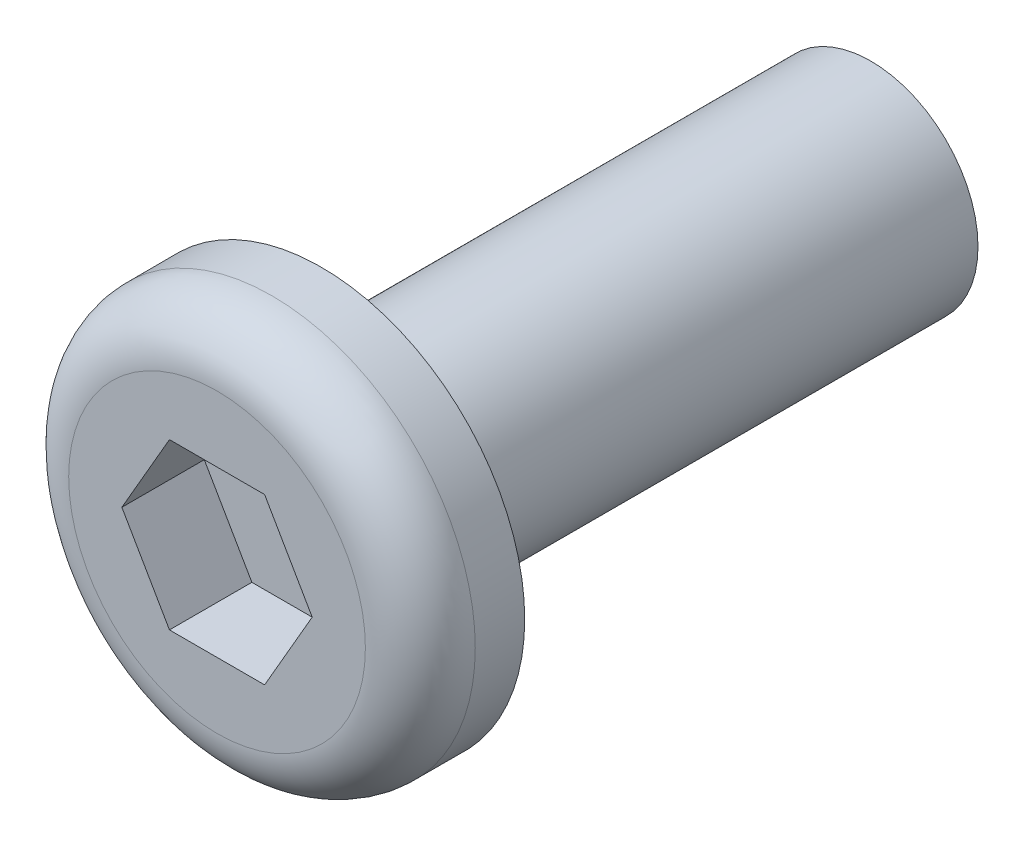
ISO-10303-21;
HEADER;
FILE_DESCRIPTION(('STEP AP214'),'2;1');
FILE_NAME('part.step','',(''),(''),'','','');
FILE_SCHEMA(('AUTOMOTIVE_DESIGN { 1 0 10303 214 1 1 1 1 }'));
ENDSEC;
DATA;
#1=APPLICATION_CONTEXT('core data for automotive mechanical design processes');
#2=APPLICATION_PROTOCOL_DEFINITION('international standard','automotive_design',2000,#1);
#3=PRODUCT_CONTEXT('',#1,'mechanical');
#4=PRODUCT('Part','Part','',(#3));
#5=PRODUCT_RELATED_PRODUCT_CATEGORY('part','',(#4));
#6=PRODUCT_DEFINITION_FORMATION('','',#4);
#7=PRODUCT_DEFINITION_CONTEXT('part definition',#1,'design');
#8=PRODUCT_DEFINITION('design','',#6,#7);
#9=PRODUCT_DEFINITION_SHAPE('','',#8);
#10=(LENGTH_UNIT() NAMED_UNIT(*) SI_UNIT(.MILLI.,.METRE.));
#11=(NAMED_UNIT(*) PLANE_ANGLE_UNIT() SI_UNIT($,.RADIAN.));
#12=(NAMED_UNIT(*) SI_UNIT($,.STERADIAN.) SOLID_ANGLE_UNIT());
#13=UNCERTAINTY_MEASURE_WITH_UNIT(LENGTH_MEASURE(1.E-05),#10,'distance_accuracy_value','');
#14=(GEOMETRIC_REPRESENTATION_CONTEXT(3) GLOBAL_UNCERTAINTY_ASSIGNED_CONTEXT((#13)) GLOBAL_UNIT_ASSIGNED_CONTEXT((#10,
#11,#12)) REPRESENTATION_CONTEXT('',''));
#15=CARTESIAN_POINT('',(0.,0.,0.));
#16=DIRECTION('',(0.,0.,1.));
#17=DIRECTION('',(1.,0.,0.));
#18=AXIS2_PLACEMENT_3D('',#15,#16,#17);
#19=CARTESIAN_POINT('',(0.,3.7,0.));
#20=DIRECTION('',(0.,0.,-1.));
#21=DIRECTION('',(-1.,0.,0.));
#22=AXIS2_PLACEMENT_3D('',#19,#20,#21);
#23=PLANE('',#22);
#24=DIRECTION('',(0.5,-0.866025403784439,0.));
#25=VECTOR('',#24,1.);
#26=CARTESIAN_POINT('',(-1.73205080756888,0.,0.));
#27=LINE('',#26,#25);
#28=CARTESIAN_POINT('',(-1.73205080756888,0.,0.));
#29=VERTEX_POINT('',#28);
#30=CARTESIAN_POINT('',(-0.86602540378444,-1.5,0.));
#31=VERTEX_POINT('',#30);
#32=EDGE_CURVE('E121',#29,#31,#27,.T.);
#33=ORIENTED_EDGE('',*,*,#32,.F.);
#34=DIRECTION('',(-0.5,-0.866025403784439,0.));
#35=VECTOR('',#34,1.);
#36=CARTESIAN_POINT('',(-0.866025403784439,1.5,0.));
#37=LINE('',#36,#35);
#38=CARTESIAN_POINT('',(-0.866025403784439,1.5,0.));
#39=VERTEX_POINT('',#38);
#40=EDGE_CURVE('E47',#39,#29,#37,.T.);
#41=ORIENTED_EDGE('',*,*,#40,.F.);
#42=DIRECTION('',(-1.,0.,0.));
#43=VECTOR('',#42,1.);
#44=CARTESIAN_POINT('',(0.866025403784439,1.5,0.));
#45=LINE('',#44,#43);
#46=CARTESIAN_POINT('',(0.866025403784439,1.5,0.));
#47=VERTEX_POINT('',#46);
#48=EDGE_CURVE('E130',#47,#39,#45,.T.);
#49=ORIENTED_EDGE('',*,*,#48,.F.);
#50=DIRECTION('',(-0.5,0.866025403784439,0.));
#51=VECTOR('',#50,1.);
#52=CARTESIAN_POINT('',(1.73205080756888,0.,0.));
#53=LINE('',#52,#51);
#54=CARTESIAN_POINT('',(1.73205080756888,0.,0.));
#55=VERTEX_POINT('',#54);
#56=EDGE_CURVE('E128',#55,#47,#53,.T.);
#57=ORIENTED_EDGE('',*,*,#56,.F.);
#58=DIRECTION('',(0.5,0.866025403784439,0.));
#59=VECTOR('',#58,1.);
#60=CARTESIAN_POINT('',(0.866025403784438,-1.5,0.));
#61=LINE('',#60,#59);
#62=CARTESIAN_POINT('',(0.866025403784438,-1.5,0.));
#63=VERTEX_POINT('',#62);
#64=EDGE_CURVE('E95',#63,#55,#61,.T.);
#65=ORIENTED_EDGE('',*,*,#64,.F.);
#66=DIRECTION('',(1.,0.,0.));
#67=VECTOR('',#66,1.);
#68=CARTESIAN_POINT('',(-0.86602540378444,-1.5,0.));
#69=LINE('',#68,#67);
#70=EDGE_CURVE('E124',#31,#63,#69,.T.);
#71=ORIENTED_EDGE('',*,*,#70,.F.);
#72=EDGE_LOOP('',(#33,#41,#49,#57,#65,#71));
#73=FACE_BOUND('',#72,.T.);
#74=CARTESIAN_POINT('',(0.,0.,0.));
#75=DIRECTION('',(0.,0.,-1.));
#76=DIRECTION('',(-1.,0.,0.));
#77=AXIS2_PLACEMENT_3D('',#74,#75,#76);
#78=CIRCLE('',#77,2.7);
#79=CARTESIAN_POINT('',(-2.7,0.,0.));
#80=VERTEX_POINT('',#79);
#81=EDGE_CURVE('E40',#80,#80,#78,.F.);
#82=ORIENTED_EDGE('',*,*,#81,.T.);
#83=EDGE_LOOP('',(#82));
#84=FACE_BOUND('',#83,.T.);
#85=ADVANCED_FACE('F32',(#73,#84),#23,.F.);
#86=CARTESIAN_POINT('',(0.,0.,-11.9));
#87=DIRECTION('',(0.,0.,1.));
#88=DIRECTION('',(1.,0.,0.));
#89=AXIS2_PLACEMENT_3D('',#86,#87,#88);
#90=PLANE('',#89);
#91=CARTESIAN_POINT('',(0.,0.,-11.9));
#92=DIRECTION('',(0.,0.,1.));
#93=DIRECTION('',(1.,0.,0.));
#94=AXIS2_PLACEMENT_3D('',#91,#92,#93);
#95=CIRCLE('',#94,1.95);
#96=CARTESIAN_POINT('',(1.95,0.,-11.9));
#97=VERTEX_POINT('',#96);
#98=EDGE_CURVE('E145',#97,#97,#95,.T.);
#99=ORIENTED_EDGE('',*,*,#98,.F.);
#100=EDGE_LOOP('',(#99));
#101=FACE_BOUND('',#100,.T.);
#102=ADVANCED_FACE('F166',(#101),#90,.F.);
#103=CARTESIAN_POINT('',(0.,0.,0.));
#104=DIRECTION('',(0.,0.,1.));
#105=DIRECTION('',(1.,0.,0.));
#106=AXIS2_PLACEMENT_3D('',#103,#104,#105);
#107=CYLINDRICAL_SURFACE('',#106,1.95);
#108=CARTESIAN_POINT('',(0.,0.,-1.9));
#109=DIRECTION('',(0.,0.,1.));
#110=DIRECTION('',(1.,0.,0.));
#111=AXIS2_PLACEMENT_3D('',#108,#109,#110);
#112=CIRCLE('',#111,1.95);
#113=CARTESIAN_POINT('',(1.95,0.,-1.9));
#114=VERTEX_POINT('',#113);
#115=EDGE_CURVE('E142',#114,#114,#112,.T.);
#116=ORIENTED_EDGE('',*,*,#115,.F.);
#117=EDGE_LOOP('',(#116));
#118=FACE_BOUND('',#117,.T.);
#119=ORIENTED_EDGE('',*,*,#98,.T.);
#120=EDGE_LOOP('',(#119));
#121=FACE_BOUND('',#120,.T.);
#122=ADVANCED_FACE('F171',(#118,#121),#107,.T.);
#123=CARTESIAN_POINT('',(0.,1.95,-1.9));
#124=DIRECTION('',(0.,0.,1.));
#125=DIRECTION('',(1.,0.,0.));
#126=AXIS2_PLACEMENT_3D('',#123,#124,#125);
#127=PLANE('',#126);
#128=CARTESIAN_POINT('',(0.,0.,-1.9));
#129=DIRECTION('',(0.,0.,1.));
#130=DIRECTION('',(1.,0.,0.));
#131=AXIS2_PLACEMENT_3D('',#128,#129,#130);
#132=CIRCLE('',#131,3.7);
#133=CARTESIAN_POINT('',(3.7,0.,-1.9));
#134=VERTEX_POINT('',#133);
#135=EDGE_CURVE('E134',#134,#134,#132,.T.);
#136=ORIENTED_EDGE('',*,*,#135,.F.);
#137=EDGE_LOOP('',(#136));
#138=FACE_BOUND('',#137,.T.);
#139=ORIENTED_EDGE('',*,*,#115,.T.);
#140=EDGE_LOOP('',(#139));
#141=FACE_BOUND('',#140,.T.);
#142=ADVANCED_FACE('F161',(#138,#141),#127,.F.);
#143=CARTESIAN_POINT('',(0.,0.,0.));
#144=DIRECTION('',(0.,0.,1.));
#145=DIRECTION('',(1.,0.,0.));
#146=AXIS2_PLACEMENT_3D('',#143,#144,#145);
#147=CYLINDRICAL_SURFACE('',#146,3.7);
#148=CARTESIAN_POINT('',(0.,0.,-1.));
#149=DIRECTION('',(0.,0.,-1.));
#150=DIRECTION('',(-1.,0.,0.));
#151=AXIS2_PLACEMENT_3D('',#148,#149,#150);
#152=CIRCLE('',#151,3.7);
#153=CARTESIAN_POINT('',(-3.7,0.,-1.));
#154=VERTEX_POINT('',#153);
#155=EDGE_CURVE('E11',#154,#154,#152,.T.);
#156=ORIENTED_EDGE('',*,*,#155,.T.);
#157=EDGE_LOOP('',(#156));
#158=FACE_BOUND('',#157,.T.);
#159=ORIENTED_EDGE('',*,*,#135,.T.);
#160=EDGE_LOOP('',(#159));
#161=FACE_BOUND('',#160,.T.);
#162=ADVANCED_FACE('F153',(#158,#161),#147,.T.);
#163=CARTESIAN_POINT('',(0.,0.,-1.));
#164=DIRECTION('',(0.,0.,-1.));
#165=DIRECTION('',(-1.,0.,0.));
#166=AXIS2_PLACEMENT_3D('',#163,#164,#165);
#167=TOROIDAL_SURFACE('',#166,2.7,1.);
#168=ORIENTED_EDGE('',*,*,#155,.F.);
#169=EDGE_LOOP('',(#168));
#170=FACE_BOUND('',#169,.T.);
#171=ORIENTED_EDGE('',*,*,#81,.F.);
#172=EDGE_LOOP('',(#171));
#173=FACE_BOUND('',#172,.T.);
#174=ADVANCED_FACE('F34',(#170,#173),#167,.T.);
#175=CARTESIAN_POINT('',(-0.866025403784439,1.5,-1.5));
#176=DIRECTION('',(-0.866025403784439,0.5,0.));
#177=DIRECTION('',(-0.5,-0.866025403784439,0.));
#178=AXIS2_PLACEMENT_3D('',#175,#176,#177);
#179=PLANE('',#178);
#180=ORIENTED_EDGE('',*,*,#40,.T.);
#181=DIRECTION('',(0.,0.,1.));
#182=VECTOR('',#181,1.);
#183=CARTESIAN_POINT('',(-1.73205080756888,0.,-1.5));
#184=LINE('',#183,#182);
#185=CARTESIAN_POINT('',(-1.73205080756888,0.,-1.5));
#186=VERTEX_POINT('',#185);
#187=EDGE_CURVE('E77',#186,#29,#184,.T.);
#188=ORIENTED_EDGE('',*,*,#187,.F.);
#189=DIRECTION('',(-0.5,-0.866025403784439,0.));
#190=VECTOR('',#189,1.);
#191=CARTESIAN_POINT('',(-0.866025403784439,1.5,-1.5));
#192=LINE('',#191,#190);
#193=CARTESIAN_POINT('',(-0.866025403784439,1.5,-1.5));
#194=VERTEX_POINT('',#193);
#195=EDGE_CURVE('E132',#194,#186,#192,.T.);
#196=ORIENTED_EDGE('',*,*,#195,.F.);
#197=DIRECTION('',(0.,0.,1.));
#198=VECTOR('',#197,1.);
#199=CARTESIAN_POINT('',(-0.866025403784439,1.5,-1.5));
#200=LINE('',#199,#198);
#201=EDGE_CURVE('E55',#194,#39,#200,.T.);
#202=ORIENTED_EDGE('',*,*,#201,.T.);
#203=EDGE_LOOP('',(#180,#188,#196,#202));
#204=FACE_BOUND('',#203,.T.);
#205=ADVANCED_FACE('F152',(#204),#179,.F.);
#206=CARTESIAN_POINT('',(0.866025403784439,1.5,-1.5));
#207=DIRECTION('',(0.,1.,0.));
#208=DIRECTION('',(0.,0.,1.));
#209=AXIS2_PLACEMENT_3D('',#206,#207,#208);
#210=PLANE('',#209);
#211=ORIENTED_EDGE('',*,*,#48,.T.);
#212=ORIENTED_EDGE('',*,*,#201,.F.);
#213=DIRECTION('',(-1.,0.,0.));
#214=VECTOR('',#213,1.);
#215=CARTESIAN_POINT('',(0.866025403784439,1.5,-1.5));
#216=LINE('',#215,#214);
#217=CARTESIAN_POINT('',(0.866025403784439,1.5,-1.5));
#218=VERTEX_POINT('',#217);
#219=EDGE_CURVE('E107',#218,#194,#216,.T.);
#220=ORIENTED_EDGE('',*,*,#219,.F.);
#221=DIRECTION('',(0.,0.,1.));
#222=VECTOR('',#221,1.);
#223=CARTESIAN_POINT('',(0.866025403784439,1.5,-1.5));
#224=LINE('',#223,#222);
#225=EDGE_CURVE('E99',#218,#47,#224,.T.);
#226=ORIENTED_EDGE('',*,*,#225,.T.);
#227=EDGE_LOOP('',(#211,#212,#220,#226));
#228=FACE_BOUND('',#227,.T.);
#229=ADVANCED_FACE('F159',(#228),#210,.F.);
#230=CARTESIAN_POINT('',(1.73205080756888,0.,-1.5));
#231=DIRECTION('',(0.866025403784439,0.5,0.));
#232=DIRECTION('',(-0.5,0.866025403784439,0.));
#233=AXIS2_PLACEMENT_3D('',#230,#231,#232);
#234=PLANE('',#233);
#235=ORIENTED_EDGE('',*,*,#56,.T.);
#236=ORIENTED_EDGE('',*,*,#225,.F.);
#237=DIRECTION('',(-0.5,0.866025403784439,0.));
#238=VECTOR('',#237,1.);
#239=CARTESIAN_POINT('',(1.73205080756888,0.,-1.5));
#240=LINE('',#239,#238);
#241=CARTESIAN_POINT('',(1.73205080756888,0.,-1.5));
#242=VERTEX_POINT('',#241);
#243=EDGE_CURVE('E103',#242,#218,#240,.T.);
#244=ORIENTED_EDGE('',*,*,#243,.F.);
#245=DIRECTION('',(0.,0.,1.));
#246=VECTOR('',#245,1.);
#247=CARTESIAN_POINT('',(1.73205080756888,0.,-1.5));
#248=LINE('',#247,#246);
#249=EDGE_CURVE('E88',#242,#55,#248,.T.);
#250=ORIENTED_EDGE('',*,*,#249,.T.);
#251=EDGE_LOOP('',(#235,#236,#244,#250));
#252=FACE_BOUND('',#251,.T.);
#253=ADVANCED_FACE('F104',(#252),#234,.F.);
#254=CARTESIAN_POINT('',(0.866025403784438,-1.5,-1.5));
#255=DIRECTION('',(0.866025403784439,-0.5,0.));
#256=DIRECTION('',(0.5,0.866025403784439,0.));
#257=AXIS2_PLACEMENT_3D('',#254,#255,#256);
#258=PLANE('',#257);
#259=ORIENTED_EDGE('',*,*,#64,.T.);
#260=ORIENTED_EDGE('',*,*,#249,.F.);
#261=DIRECTION('',(0.5,0.866025403784439,0.));
#262=VECTOR('',#261,1.);
#263=CARTESIAN_POINT('',(0.866025403784438,-1.5,-1.5));
#264=LINE('',#263,#262);
#265=CARTESIAN_POINT('',(0.866025403784438,-1.5,-1.5));
#266=VERTEX_POINT('',#265);
#267=EDGE_CURVE('E92',#266,#242,#264,.T.);
#268=ORIENTED_EDGE('',*,*,#267,.F.);
#269=DIRECTION('',(0.,0.,1.));
#270=VECTOR('',#269,1.);
#271=CARTESIAN_POINT('',(0.866025403784438,-1.5,-1.5));
#272=LINE('',#271,#270);
#273=EDGE_CURVE('E100',#266,#63,#272,.T.);
#274=ORIENTED_EDGE('',*,*,#273,.T.);
#275=EDGE_LOOP('',(#259,#260,#268,#274));
#276=FACE_BOUND('',#275,.T.);
#277=ADVANCED_FACE('F90',(#276),#258,.F.);
#278=CARTESIAN_POINT('',(-0.86602540378444,-1.5,-1.5));
#279=DIRECTION('',(0.,-1.,0.));
#280=DIRECTION('',(1.,0.,0.));
#281=AXIS2_PLACEMENT_3D('',#278,#279,#280);
#282=PLANE('',#281);
#283=ORIENTED_EDGE('',*,*,#70,.T.);
#284=ORIENTED_EDGE('',*,*,#273,.F.);
#285=DIRECTION('',(1.,0.,0.));
#286=VECTOR('',#285,1.);
#287=CARTESIAN_POINT('',(-0.86602540378444,-1.5,-1.5));
#288=LINE('',#287,#286);
#289=CARTESIAN_POINT('',(-0.86602540378444,-1.5,-1.5));
#290=VERTEX_POINT('',#289);
#291=EDGE_CURVE('E113',#290,#266,#288,.T.);
#292=ORIENTED_EDGE('',*,*,#291,.F.);
#293=DIRECTION('',(0.,0.,1.));
#294=VECTOR('',#293,1.);
#295=CARTESIAN_POINT('',(-0.86602540378444,-1.5,-1.5));
#296=LINE('',#295,#294);
#297=EDGE_CURVE('E137',#290,#31,#296,.T.);
#298=ORIENTED_EDGE('',*,*,#297,.T.);
#299=EDGE_LOOP('',(#283,#284,#292,#298));
#300=FACE_BOUND('',#299,.T.);
#301=ADVANCED_FACE('F185',(#300),#282,.F.);
#302=CARTESIAN_POINT('',(-1.73205080756888,0.,-1.5));
#303=DIRECTION('',(-0.866025403784439,-0.5,0.));
#304=DIRECTION('',(0.5,-0.866025403784439,0.));
#305=AXIS2_PLACEMENT_3D('',#302,#303,#304);
#306=PLANE('',#305);
#307=ORIENTED_EDGE('',*,*,#32,.T.);
#308=ORIENTED_EDGE('',*,*,#297,.F.);
#309=DIRECTION('',(0.5,-0.866025403784439,0.));
#310=VECTOR('',#309,1.);
#311=CARTESIAN_POINT('',(-1.73205080756888,0.,-1.5));
#312=LINE('',#311,#310);
#313=EDGE_CURVE('E115',#186,#290,#312,.T.);
#314=ORIENTED_EDGE('',*,*,#313,.F.);
#315=ORIENTED_EDGE('',*,*,#187,.T.);
#316=EDGE_LOOP('',(#307,#308,#314,#315));
#317=FACE_BOUND('',#316,.T.);
#318=ADVANCED_FACE('F182',(#317),#306,.F.);
#319=CARTESIAN_POINT('',(0.,0.,-1.5));
#320=DIRECTION('',(0.,0.,1.));
#321=DIRECTION('',(1.,0.,0.));
#322=AXIS2_PLACEMENT_3D('',#319,#320,#321);
#323=PLANE('',#322);
#324=ORIENTED_EDGE('',*,*,#195,.T.);
#325=ORIENTED_EDGE('',*,*,#313,.T.);
#326=ORIENTED_EDGE('',*,*,#291,.T.);
#327=ORIENTED_EDGE('',*,*,#267,.T.);
#328=ORIENTED_EDGE('',*,*,#243,.T.);
#329=ORIENTED_EDGE('',*,*,#219,.T.);
#330=EDGE_LOOP('',(#324,#325,#326,#327,#328,#329));
#331=FACE_BOUND('',#330,.T.);
#332=ADVANCED_FACE('F110',(#331),#323,.T.);
#333=CLOSED_SHELL('',(#85,#102,#122,#142,#162,#174,#205,#229,#253,#277,#301,#318,#332));
#334=MANIFOLD_SOLID_BREP('B2',#333);
#335=ADVANCED_BREP_SHAPE_REPRESENTATION('',(#18,#334),#14);
#336=SHAPE_DEFINITION_REPRESENTATION(#9,#335);
ENDSEC;
END-ISO-10303-21;
